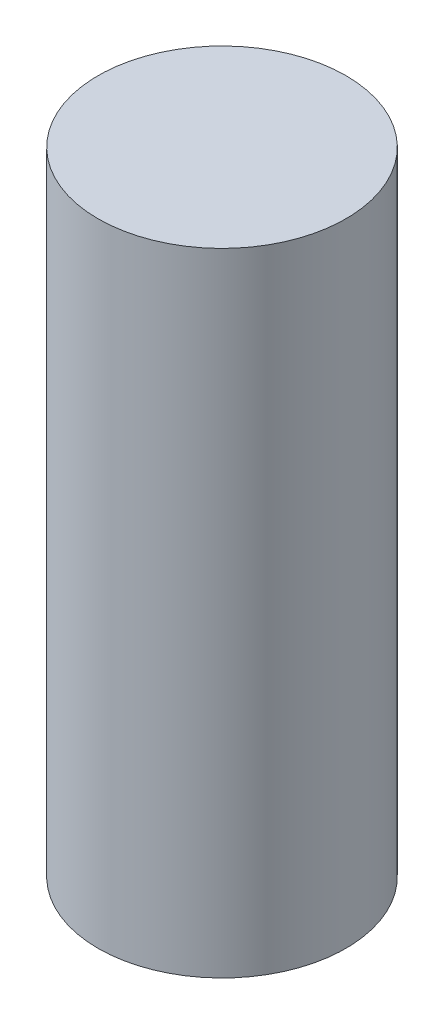
ISO-10303-21;
HEADER;
FILE_DESCRIPTION(('STEP AP214'),'2;1');
FILE_NAME('part.step','',(''),(''),'','','');
FILE_SCHEMA(('AUTOMOTIVE_DESIGN { 1 0 10303 214 1 1 1 1 }'));
ENDSEC;
DATA;
#1=APPLICATION_CONTEXT('core data for automotive mechanical design processes');
#2=APPLICATION_PROTOCOL_DEFINITION('international standard','automotive_design',2000,#1);
#3=PRODUCT_CONTEXT('',#1,'mechanical');
#4=PRODUCT('Part','Part','',(#3));
#5=PRODUCT_RELATED_PRODUCT_CATEGORY('part','',(#4));
#6=PRODUCT_DEFINITION_FORMATION('','',#4);
#7=PRODUCT_DEFINITION_CONTEXT('part definition',#1,'design');
#8=PRODUCT_DEFINITION('design','',#6,#7);
#9=PRODUCT_DEFINITION_SHAPE('','',#8);
#10=(LENGTH_UNIT() NAMED_UNIT(*) SI_UNIT(.MILLI.,.METRE.));
#11=(NAMED_UNIT(*) PLANE_ANGLE_UNIT() SI_UNIT($,.RADIAN.));
#12=(NAMED_UNIT(*) SI_UNIT($,.STERADIAN.) SOLID_ANGLE_UNIT());
#13=UNCERTAINTY_MEASURE_WITH_UNIT(LENGTH_MEASURE(1.E-05),#10,'distance_accuracy_value','');
#14=(GEOMETRIC_REPRESENTATION_CONTEXT(3) GLOBAL_UNCERTAINTY_ASSIGNED_CONTEXT((#13)) GLOBAL_UNIT_ASSIGNED_CONTEXT((#10,
#11,#12)) REPRESENTATION_CONTEXT('',''));
#15=CARTESIAN_POINT('',(0.,0.,0.));
#16=DIRECTION('',(0.,0.,1.));
#17=DIRECTION('',(1.,0.,0.));
#18=AXIS2_PLACEMENT_3D('',#15,#16,#17);
#19=CARTESIAN_POINT('',(0.,330.,0.));
#20=DIRECTION('',(0.,-1.,0.));
#21=DIRECTION('',(0.,0.,-1.));
#22=AXIS2_PLACEMENT_3D('',#19,#20,#21);
#23=CYLINDRICAL_SURFACE('',#22,64.75);
#24=CARTESIAN_POINT('',(0.,330.,0.));
#25=DIRECTION('',(0.,1.,0.));
#26=DIRECTION('',(0.,0.,1.));
#27=AXIS2_PLACEMENT_3D('',#24,#25,#26);
#28=CIRCLE('',#27,64.75);
#29=CARTESIAN_POINT('',(0.,330.,64.75));
#30=VERTEX_POINT('',#29);
#31=EDGE_CURVE('E10',#30,#30,#28,.T.);
#32=ORIENTED_EDGE('',*,*,#31,.F.);
#33=EDGE_LOOP('',(#32));
#34=FACE_BOUND('',#33,.T.);
#35=CARTESIAN_POINT('',(0.,0.,0.));
#36=DIRECTION('',(0.,1.,0.));
#37=DIRECTION('',(0.,0.,1.));
#38=AXIS2_PLACEMENT_3D('',#35,#36,#37);
#39=CIRCLE('',#38,64.75);
#40=CARTESIAN_POINT('',(0.,0.,64.75));
#41=VERTEX_POINT('',#40);
#42=EDGE_CURVE('E34',#41,#41,#39,.T.);
#43=ORIENTED_EDGE('',*,*,#42,.T.);
#44=EDGE_LOOP('',(#43));
#45=FACE_BOUND('',#44,.T.);
#46=ADVANCED_FACE('F31',(#34,#45),#23,.T.);
#47=CARTESIAN_POINT('',(0.,330.,0.));
#48=DIRECTION('',(0.,1.,0.));
#49=DIRECTION('',(0.,0.,1.));
#50=AXIS2_PLACEMENT_3D('',#47,#48,#49);
#51=PLANE('',#50);
#52=ORIENTED_EDGE('',*,*,#31,.T.);
#53=EDGE_LOOP('',(#52));
#54=FACE_BOUND('',#53,.T.);
#55=ADVANCED_FACE('F46',(#54),#51,.T.);
#56=CARTESIAN_POINT('',(0.,0.,0.));
#57=DIRECTION('',(0.,1.,0.));
#58=DIRECTION('',(0.,0.,1.));
#59=AXIS2_PLACEMENT_3D('',#56,#57,#58);
#60=PLANE('',#59);
#61=ORIENTED_EDGE('',*,*,#42,.F.);
#62=EDGE_LOOP('',(#61));
#63=FACE_BOUND('',#62,.T.);
#64=ADVANCED_FACE('F44',(#63),#60,.F.);
#65=CLOSED_SHELL('',(#46,#55,#64));
#66=MANIFOLD_SOLID_BREP('B2',#65);
#67=ADVANCED_BREP_SHAPE_REPRESENTATION('',(#18,#66),#14);
#68=SHAPE_DEFINITION_REPRESENTATION(#9,#67);
ENDSEC;
END-ISO-10303-21;
